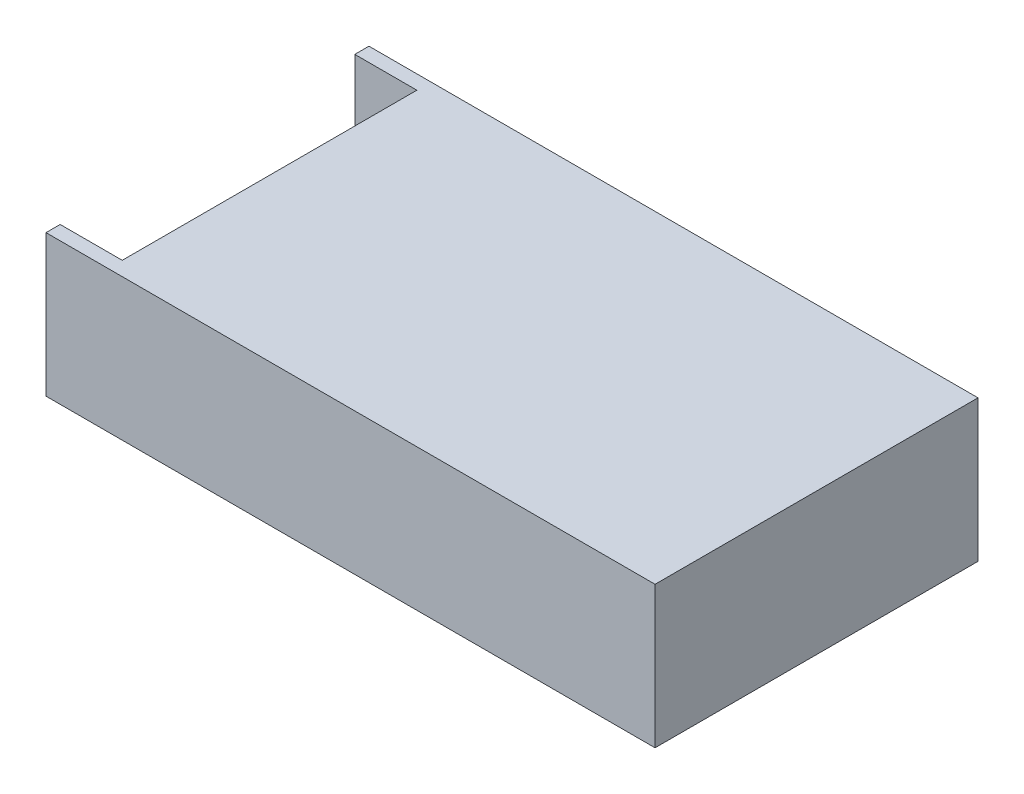
ISO-10303-21;
HEADER;
FILE_DESCRIPTION(('STEP AP214'),'2;1');
FILE_NAME('part.step','',(''),(''),'','','');
FILE_SCHEMA(('AUTOMOTIVE_DESIGN { 1 0 10303 214 1 1 1 1 }'));
ENDSEC;
DATA;
#1=APPLICATION_CONTEXT('core data for automotive mechanical design processes');
#2=APPLICATION_PROTOCOL_DEFINITION('international standard','automotive_design',2000,#1);
#3=PRODUCT_CONTEXT('',#1,'mechanical');
#4=PRODUCT('Part','Part','',(#3));
#5=PRODUCT_RELATED_PRODUCT_CATEGORY('part','',(#4));
#6=PRODUCT_DEFINITION_FORMATION('','',#4);
#7=PRODUCT_DEFINITION_CONTEXT('part definition',#1,'design');
#8=PRODUCT_DEFINITION('design','',#6,#7);
#9=PRODUCT_DEFINITION_SHAPE('','',#8);
#10=(LENGTH_UNIT() NAMED_UNIT(*) SI_UNIT(.MILLI.,.METRE.));
#11=(NAMED_UNIT(*) PLANE_ANGLE_UNIT() SI_UNIT($,.RADIAN.));
#12=(NAMED_UNIT(*) SI_UNIT($,.STERADIAN.) SOLID_ANGLE_UNIT());
#13=UNCERTAINTY_MEASURE_WITH_UNIT(LENGTH_MEASURE(1.E-05),#10,'distance_accuracy_value','');
#14=(GEOMETRIC_REPRESENTATION_CONTEXT(3) GLOBAL_UNCERTAINTY_ASSIGNED_CONTEXT((#13)) GLOBAL_UNIT_ASSIGNED_CONTEXT((#10,
#11,#12)) REPRESENTATION_CONTEXT('',''));
#15=CARTESIAN_POINT('',(0.,0.,0.));
#16=DIRECTION('',(0.,0.,1.));
#17=DIRECTION('',(1.,0.,0.));
#18=AXIS2_PLACEMENT_3D('',#15,#16,#17);
#19=CARTESIAN_POINT('',(-107.5,50.,-57.));
#20=DIRECTION('',(1.,0.,0.));
#21=DIRECTION('',(0.,0.,-1.));
#22=AXIS2_PLACEMENT_3D('',#19,#20,#21);
#23=PLANE('',#22);
#24=DIRECTION('',(0.,-1.,0.));
#25=VECTOR('',#24,1.);
#26=CARTESIAN_POINT('',(-107.5,6.42688909164235,52.));
#27=LINE('',#26,#25);
#28=CARTESIAN_POINT('',(-107.5,50.,52.));
#29=VERTEX_POINT('',#28);
#30=CARTESIAN_POINT('',(-107.5,6.42688909164235,52.));
#31=VERTEX_POINT('',#30);
#32=EDGE_CURVE('E139',#29,#31,#27,.T.);
#33=ORIENTED_EDGE('',*,*,#32,.T.);
#34=DIRECTION('',(0.,0.,1.));
#35=VECTOR('',#34,1.);
#36=CARTESIAN_POINT('',(-107.5,6.42688909164235,-105.773690868953));
#37=LINE('',#36,#35);
#38=CARTESIAN_POINT('',(-107.5,6.42688909164235,-52.));
#39=VERTEX_POINT('',#38);
#40=EDGE_CURVE('E121',#39,#31,#37,.T.);
#41=ORIENTED_EDGE('',*,*,#40,.F.);
#42=DIRECTION('',(0.,1.,0.));
#43=VECTOR('',#42,1.);
#44=CARTESIAN_POINT('',(-107.5,6.42688909164235,-52.));
#45=LINE('',#44,#43);
#46=CARTESIAN_POINT('',(-107.5,50.,-52.));
#47=VERTEX_POINT('',#46);
#48=EDGE_CURVE('E166',#39,#47,#45,.T.);
#49=ORIENTED_EDGE('',*,*,#48,.T.);
#50=DIRECTION('',(0.,0.,1.));
#51=VECTOR('',#50,1.);
#52=CARTESIAN_POINT('',(-107.5,50.,-57.));
#53=LINE('',#52,#51);
#54=CARTESIAN_POINT('',(-107.5,50.,-57.));
#55=VERTEX_POINT('',#54);
#56=EDGE_CURVE('E172',#55,#47,#53,.T.);
#57=ORIENTED_EDGE('',*,*,#56,.F.);
#58=DIRECTION('',(0.,-1.,0.));
#59=VECTOR('',#58,1.);
#60=CARTESIAN_POINT('',(-107.5,50.,-57.));
#61=LINE('',#60,#59);
#62=CARTESIAN_POINT('',(-107.5,0.,-57.));
#63=VERTEX_POINT('',#62);
#64=EDGE_CURVE('E43',#55,#63,#61,.T.);
#65=ORIENTED_EDGE('',*,*,#64,.T.);
#66=DIRECTION('',(0.,0.,1.));
#67=VECTOR('',#66,1.);
#68=CARTESIAN_POINT('',(-107.5,0.,-57.));
#69=LINE('',#68,#67);
#70=CARTESIAN_POINT('',(-107.5,0.,57.));
#71=VERTEX_POINT('',#70);
#72=EDGE_CURVE('E181',#63,#71,#69,.T.);
#73=ORIENTED_EDGE('',*,*,#72,.T.);
#74=DIRECTION('',(0.,-1.,0.));
#75=VECTOR('',#74,1.);
#76=CARTESIAN_POINT('',(-107.5,50.,57.));
#77=LINE('',#76,#75);
#78=CARTESIAN_POINT('',(-107.5,50.,57.));
#79=VERTEX_POINT('',#78);
#80=EDGE_CURVE('E185',#79,#71,#77,.T.);
#81=ORIENTED_EDGE('',*,*,#80,.F.);
#82=EDGE_CURVE('E147',#29,#79,#53,.T.);
#83=ORIENTED_EDGE('',*,*,#82,.F.);
#84=EDGE_LOOP('',(#33,#41,#49,#57,#65,#73,#81,#83));
#85=FACE_BOUND('',#84,.T.);
#86=ADVANCED_FACE('F35',(#85),#23,.F.);
#87=CARTESIAN_POINT('',(0.,50.,0.));
#88=DIRECTION('',(0.,1.,0.));
#89=DIRECTION('',(0.,0.,1.));
#90=AXIS2_PLACEMENT_3D('',#87,#88,#89);
#91=PLANE('',#90);
#92=DIRECTION('',(0.,0.,1.));
#93=VECTOR('',#92,1.);
#94=CARTESIAN_POINT('',(-85.5852349602344,50.,-105.773690868953));
#95=LINE('',#94,#93);
#96=CARTESIAN_POINT('',(-85.5852349602344,50.,-52.));
#97=VERTEX_POINT('',#96);
#98=CARTESIAN_POINT('',(-85.5852349602344,50.,52.));
#99=VERTEX_POINT('',#98);
#100=EDGE_CURVE('E50',#97,#99,#95,.T.);
#101=ORIENTED_EDGE('',*,*,#100,.T.);
#102=DIRECTION('',(-1.,0.,0.));
#103=VECTOR('',#102,1.);
#104=CARTESIAN_POINT('',(-107.5,50.,52.));
#105=LINE('',#104,#103);
#106=EDGE_CURVE('E133',#99,#29,#105,.T.);
#107=ORIENTED_EDGE('',*,*,#106,.T.);
#108=ORIENTED_EDGE('',*,*,#82,.T.);
#109=DIRECTION('',(1.,0.,0.));
#110=VECTOR('',#109,1.);
#111=CARTESIAN_POINT('',(-107.5,50.,57.));
#112=LINE('',#111,#110);
#113=CARTESIAN_POINT('',(107.5,50.,57.));
#114=VERTEX_POINT('',#113);
#115=EDGE_CURVE('E59',#79,#114,#112,.T.);
#116=ORIENTED_EDGE('',*,*,#115,.T.);
#117=DIRECTION('',(0.,0.,-1.));
#118=VECTOR('',#117,1.);
#119=CARTESIAN_POINT('',(107.5,50.,-57.));
#120=LINE('',#119,#118);
#121=CARTESIAN_POINT('',(107.5,50.,-57.));
#122=VERTEX_POINT('',#121);
#123=EDGE_CURVE('E169',#114,#122,#120,.T.);
#124=ORIENTED_EDGE('',*,*,#123,.T.);
#125=DIRECTION('',(-1.,0.,0.));
#126=VECTOR('',#125,1.);
#127=CARTESIAN_POINT('',(-107.5,50.,-57.));
#128=LINE('',#127,#126);
#129=EDGE_CURVE('E87',#122,#55,#128,.T.);
#130=ORIENTED_EDGE('',*,*,#129,.T.);
#131=ORIENTED_EDGE('',*,*,#56,.T.);
#132=DIRECTION('',(1.,0.,0.));
#133=VECTOR('',#132,1.);
#134=CARTESIAN_POINT('',(-107.5,50.,-52.));
#135=LINE('',#134,#133);
#136=EDGE_CURVE('E150',#47,#97,#135,.T.);
#137=ORIENTED_EDGE('',*,*,#136,.T.);
#138=EDGE_LOOP('',(#101,#107,#108,#116,#124,#130,#131,#137));
#139=FACE_BOUND('',#138,.T.);
#140=ADVANCED_FACE('F207',(#139),#91,.T.);
#141=CARTESIAN_POINT('',(107.5,50.,-57.));
#142=DIRECTION('',(-1.,0.,0.));
#143=DIRECTION('',(0.,0.,1.));
#144=AXIS2_PLACEMENT_3D('',#141,#142,#143);
#145=PLANE('',#144);
#146=DIRECTION('',(0.,0.,-1.));
#147=VECTOR('',#146,1.);
#148=CARTESIAN_POINT('',(107.5,0.,-57.));
#149=LINE('',#148,#147);
#150=CARTESIAN_POINT('',(107.5,0.,57.));
#151=VERTEX_POINT('',#150);
#152=CARTESIAN_POINT('',(107.5,0.,-57.));
#153=VERTEX_POINT('',#152);
#154=EDGE_CURVE('E168',#151,#153,#149,.T.);
#155=ORIENTED_EDGE('',*,*,#154,.T.);
#156=DIRECTION('',(0.,-1.,0.));
#157=VECTOR('',#156,1.);
#158=CARTESIAN_POINT('',(107.5,50.,-57.));
#159=LINE('',#158,#157);
#160=EDGE_CURVE('E12',#122,#153,#159,.T.);
#161=ORIENTED_EDGE('',*,*,#160,.F.);
#162=ORIENTED_EDGE('',*,*,#123,.F.);
#163=DIRECTION('',(0.,-1.,0.));
#164=VECTOR('',#163,1.);
#165=CARTESIAN_POINT('',(107.5,50.,57.));
#166=LINE('',#165,#164);
#167=EDGE_CURVE('E176',#114,#151,#166,.T.);
#168=ORIENTED_EDGE('',*,*,#167,.T.);
#169=EDGE_LOOP('',(#155,#161,#162,#168));
#170=FACE_BOUND('',#169,.T.);
#171=ADVANCED_FACE('F37',(#170),#145,.F.);
#172=CARTESIAN_POINT('',(-107.5,50.,-57.));
#173=DIRECTION('',(0.,0.,1.));
#174=DIRECTION('',(1.,0.,0.));
#175=AXIS2_PLACEMENT_3D('',#172,#173,#174);
#176=PLANE('',#175);
#177=DIRECTION('',(-1.,0.,0.));
#178=VECTOR('',#177,1.);
#179=CARTESIAN_POINT('',(-107.5,0.,-57.));
#180=LINE('',#179,#178);
#181=EDGE_CURVE('E179',#153,#63,#180,.T.);
#182=ORIENTED_EDGE('',*,*,#181,.T.);
#183=ORIENTED_EDGE('',*,*,#64,.F.);
#184=ORIENTED_EDGE('',*,*,#129,.F.);
#185=ORIENTED_EDGE('',*,*,#160,.T.);
#186=EDGE_LOOP('',(#182,#183,#184,#185));
#187=FACE_BOUND('',#186,.T.);
#188=ADVANCED_FACE('F197',(#187),#176,.F.);
#189=CARTESIAN_POINT('',(-107.5,50.,57.));
#190=DIRECTION('',(0.,0.,-1.));
#191=DIRECTION('',(-1.,0.,0.));
#192=AXIS2_PLACEMENT_3D('',#189,#190,#191);
#193=PLANE('',#192);
#194=DIRECTION('',(1.,0.,0.));
#195=VECTOR('',#194,1.);
#196=CARTESIAN_POINT('',(-107.5,0.,57.));
#197=LINE('',#196,#195);
#198=EDGE_CURVE('E80',#71,#151,#197,.T.);
#199=ORIENTED_EDGE('',*,*,#198,.T.);
#200=ORIENTED_EDGE('',*,*,#167,.F.);
#201=ORIENTED_EDGE('',*,*,#115,.F.);
#202=ORIENTED_EDGE('',*,*,#80,.T.);
#203=EDGE_LOOP('',(#199,#200,#201,#202));
#204=FACE_BOUND('',#203,.T.);
#205=ADVANCED_FACE('F195',(#204),#193,.F.);
#206=CARTESIAN_POINT('',(0.,0.,0.));
#207=DIRECTION('',(0.,1.,0.));
#208=DIRECTION('',(0.,0.,1.));
#209=AXIS2_PLACEMENT_3D('',#206,#207,#208);
#210=PLANE('',#209);
#211=ORIENTED_EDGE('',*,*,#154,.F.);
#212=ORIENTED_EDGE('',*,*,#198,.F.);
#213=ORIENTED_EDGE('',*,*,#72,.F.);
#214=ORIENTED_EDGE('',*,*,#181,.F.);
#215=EDGE_LOOP('',(#211,#212,#213,#214));
#216=FACE_BOUND('',#215,.T.);
#217=ADVANCED_FACE('F191',(#216),#210,.F.);
#218=CARTESIAN_POINT('',(-85.5852349602344,50.,-105.773690868953));
#219=DIRECTION('',(1.,0.,0.));
#220=DIRECTION('',(0.,0.,-1.));
#221=AXIS2_PLACEMENT_3D('',#218,#219,#220);
#222=PLANE('',#221);
#223=DIRECTION('',(0.,-1.,0.));
#224=VECTOR('',#223,1.);
#225=CARTESIAN_POINT('',(-85.5852349602344,50.,-52.));
#226=LINE('',#225,#224);
#227=CARTESIAN_POINT('',(-85.5852349602344,16.1338908097548,-52.));
#228=VERTEX_POINT('',#227);
#229=EDGE_CURVE('E237',#97,#228,#226,.T.);
#230=ORIENTED_EDGE('',*,*,#229,.T.);
#231=DIRECTION('',(0.,0.,1.));
#232=VECTOR('',#231,1.);
#233=CARTESIAN_POINT('',(-85.5852349602344,16.1338908097548,-105.773690868953));
#234=LINE('',#233,#232);
#235=CARTESIAN_POINT('',(-85.5852349602344,16.1338908097548,52.));
#236=VERTEX_POINT('',#235);
#237=EDGE_CURVE('E161',#228,#236,#234,.T.);
#238=ORIENTED_EDGE('',*,*,#237,.T.);
#239=DIRECTION('',(0.,1.,0.));
#240=VECTOR('',#239,1.);
#241=CARTESIAN_POINT('',(-85.5852349602344,50.,52.));
#242=LINE('',#241,#240);
#243=EDGE_CURVE('E157',#236,#99,#242,.T.);
#244=ORIENTED_EDGE('',*,*,#243,.T.);
#245=ORIENTED_EDGE('',*,*,#100,.F.);
#246=EDGE_LOOP('',(#230,#238,#244,#245));
#247=FACE_BOUND('',#246,.T.);
#248=ADVANCED_FACE('F203',(#247),#222,.F.);
#249=CARTESIAN_POINT('',(-102.483117777339,16.1338908097548,-105.773690868953));
#250=DIRECTION('',(0.,-1.,0.));
#251=DIRECTION('',(0.,0.,-1.));
#252=AXIS2_PLACEMENT_3D('',#249,#250,#251);
#253=PLANE('',#252);
#254=DIRECTION('',(-1.,0.,0.));
#255=VECTOR('',#254,1.);
#256=CARTESIAN_POINT('',(-102.483117777339,16.1338908097548,-52.));
#257=LINE('',#256,#255);
#258=CARTESIAN_POINT('',(-102.483117777339,16.1338908097548,-52.));
#259=VERTEX_POINT('',#258);
#260=EDGE_CURVE('E238',#228,#259,#257,.T.);
#261=ORIENTED_EDGE('',*,*,#260,.T.);
#262=DIRECTION('',(0.,0.,1.));
#263=VECTOR('',#262,1.);
#264=CARTESIAN_POINT('',(-102.483117777339,16.1338908097548,-105.773690868953));
#265=LINE('',#264,#263);
#266=CARTESIAN_POINT('',(-102.483117777339,16.1338908097548,52.));
#267=VERTEX_POINT('',#266);
#268=EDGE_CURVE('E163',#259,#267,#265,.T.);
#269=ORIENTED_EDGE('',*,*,#268,.T.);
#270=DIRECTION('',(1.,0.,0.));
#271=VECTOR('',#270,1.);
#272=CARTESIAN_POINT('',(-102.483117777339,16.1338908097548,52.));
#273=LINE('',#272,#271);
#274=EDGE_CURVE('E154',#267,#236,#273,.T.);
#275=ORIENTED_EDGE('',*,*,#274,.T.);
#276=ORIENTED_EDGE('',*,*,#237,.F.);
#277=EDGE_LOOP('',(#261,#269,#275,#276));
#278=FACE_BOUND('',#277,.T.);
#279=ADVANCED_FACE('F221',(#278),#253,.F.);
#280=CARTESIAN_POINT('',(-102.483117777339,6.42688909164235,-105.773690868953));
#281=DIRECTION('',(1.,0.,0.));
#282=DIRECTION('',(0.,0.,-1.));
#283=AXIS2_PLACEMENT_3D('',#280,#281,#282);
#284=PLANE('',#283);
#285=DIRECTION('',(0.,-1.,0.));
#286=VECTOR('',#285,1.);
#287=CARTESIAN_POINT('',(-102.483117777339,6.42688909164235,-52.));
#288=LINE('',#287,#286);
#289=CARTESIAN_POINT('',(-102.483117777339,6.42688909164235,-52.));
#290=VERTEX_POINT('',#289);
#291=EDGE_CURVE('E239',#259,#290,#288,.T.);
#292=ORIENTED_EDGE('',*,*,#291,.T.);
#293=DIRECTION('',(0.,0.,1.));
#294=VECTOR('',#293,1.);
#295=CARTESIAN_POINT('',(-102.483117777339,6.42688909164235,-105.773690868953));
#296=LINE('',#295,#294);
#297=CARTESIAN_POINT('',(-102.483117777339,6.42688909164235,52.));
#298=VERTEX_POINT('',#297);
#299=EDGE_CURVE('E132',#290,#298,#296,.T.);
#300=ORIENTED_EDGE('',*,*,#299,.T.);
#301=DIRECTION('',(0.,1.,0.));
#302=VECTOR('',#301,1.);
#303=CARTESIAN_POINT('',(-102.483117777339,6.42688909164235,52.));
#304=LINE('',#303,#302);
#305=EDGE_CURVE('E143',#298,#267,#304,.T.);
#306=ORIENTED_EDGE('',*,*,#305,.T.);
#307=ORIENTED_EDGE('',*,*,#268,.F.);
#308=EDGE_LOOP('',(#292,#300,#306,#307));
#309=FACE_BOUND('',#308,.T.);
#310=ADVANCED_FACE('F218',(#309),#284,.F.);
#311=CARTESIAN_POINT('',(-102.483117777339,6.42688909164235,-105.773690868953));
#312=DIRECTION('',(0.,-1.,0.));
#313=DIRECTION('',(0.,0.,-1.));
#314=AXIS2_PLACEMENT_3D('',#311,#312,#313);
#315=PLANE('',#314);
#316=DIRECTION('',(-1.,0.,0.));
#317=VECTOR('',#316,1.);
#318=CARTESIAN_POINT('',(-102.483117777339,6.42688909164235,-52.));
#319=LINE('',#318,#317);
#320=EDGE_CURVE('E127',#290,#39,#319,.T.);
#321=ORIENTED_EDGE('',*,*,#320,.T.);
#322=ORIENTED_EDGE('',*,*,#40,.T.);
#323=DIRECTION('',(1.,0.,0.));
#324=VECTOR('',#323,1.);
#325=CARTESIAN_POINT('',(-102.483117777339,6.42688909164235,52.));
#326=LINE('',#325,#324);
#327=EDGE_CURVE('E125',#31,#298,#326,.T.);
#328=ORIENTED_EDGE('',*,*,#327,.T.);
#329=ORIENTED_EDGE('',*,*,#299,.F.);
#330=EDGE_LOOP('',(#321,#322,#328,#329));
#331=FACE_BOUND('',#330,.T.);
#332=ADVANCED_FACE('F123',(#331),#315,.F.);
#333=CARTESIAN_POINT('',(0.,0.,52.));
#334=DIRECTION('',(0.,0.,-1.));
#335=DIRECTION('',(-1.,0.,0.));
#336=AXIS2_PLACEMENT_3D('',#333,#334,#335);
#337=PLANE('',#336);
#338=ORIENTED_EDGE('',*,*,#106,.F.);
#339=ORIENTED_EDGE('',*,*,#243,.F.);
#340=ORIENTED_EDGE('',*,*,#274,.F.);
#341=ORIENTED_EDGE('',*,*,#305,.F.);
#342=ORIENTED_EDGE('',*,*,#327,.F.);
#343=ORIENTED_EDGE('',*,*,#32,.F.);
#344=EDGE_LOOP('',(#338,#339,#340,#341,#342,#343));
#345=FACE_BOUND('',#344,.T.);
#346=ADVANCED_FACE('F138',(#345),#337,.T.);
#347=CARTESIAN_POINT('',(-107.5,50.,-52.));
#348=DIRECTION('',(0.,0.,1.));
#349=DIRECTION('',(1.,0.,0.));
#350=AXIS2_PLACEMENT_3D('',#347,#348,#349);
#351=PLANE('',#350);
#352=ORIENTED_EDGE('',*,*,#136,.F.);
#353=ORIENTED_EDGE('',*,*,#48,.F.);
#354=ORIENTED_EDGE('',*,*,#320,.F.);
#355=ORIENTED_EDGE('',*,*,#291,.F.);
#356=ORIENTED_EDGE('',*,*,#260,.F.);
#357=ORIENTED_EDGE('',*,*,#229,.F.);
#358=EDGE_LOOP('',(#352,#353,#354,#355,#356,#357));
#359=FACE_BOUND('',#358,.T.);
#360=ADVANCED_FACE('F230',(#359),#351,.T.);
#361=CLOSED_SHELL('',(#86,#140,#171,#188,#205,#217,#248,#279,#310,#332,#346,#360));
#362=MANIFOLD_SOLID_BREP('B2',#361);
#363=ADVANCED_BREP_SHAPE_REPRESENTATION('',(#18,#362),#14);
#364=SHAPE_DEFINITION_REPRESENTATION(#9,#363);
ENDSEC;
END-ISO-10303-21;
